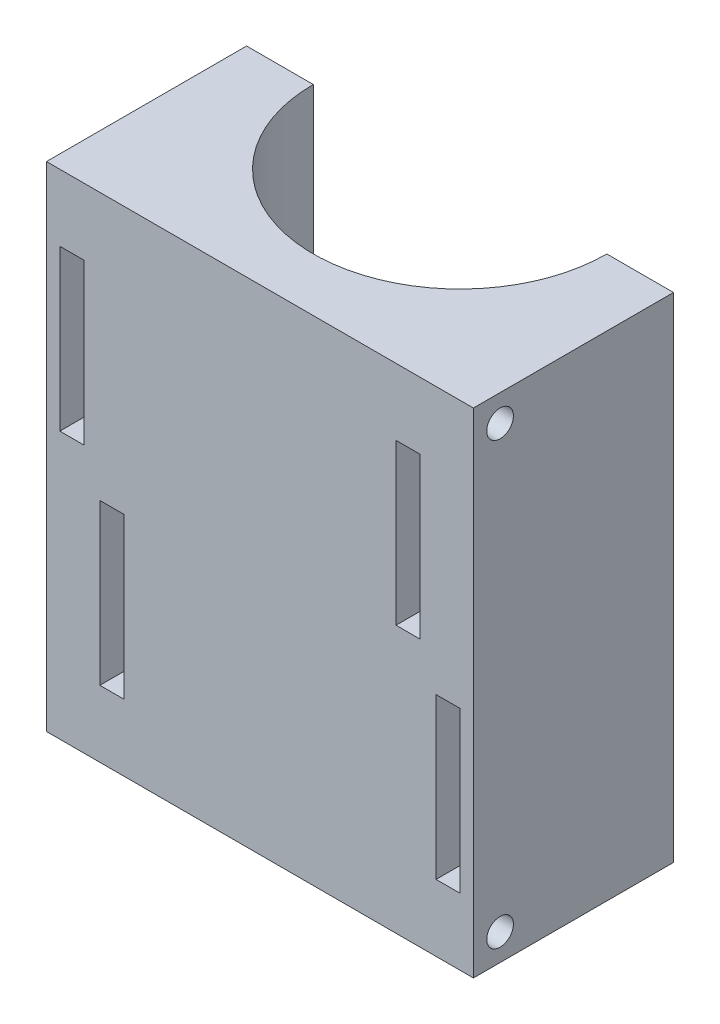
ISO-10303-21;
HEADER;
FILE_DESCRIPTION(('STEP AP214'),'2;1');
FILE_NAME('part.step','',(''),(''),'','','');
FILE_SCHEMA(('AUTOMOTIVE_DESIGN { 1 0 10303 214 1 1 1 1 }'));
ENDSEC;
DATA;
#1=APPLICATION_CONTEXT('core data for automotive mechanical design processes');
#2=APPLICATION_PROTOCOL_DEFINITION('international standard','automotive_design',2000,#1);
#3=PRODUCT_CONTEXT('',#1,'mechanical');
#4=PRODUCT('Part','Part','',(#3));
#5=PRODUCT_RELATED_PRODUCT_CATEGORY('part','',(#4));
#6=PRODUCT_DEFINITION_FORMATION('','',#4);
#7=PRODUCT_DEFINITION_CONTEXT('part definition',#1,'design');
#8=PRODUCT_DEFINITION('design','',#6,#7);
#9=PRODUCT_DEFINITION_SHAPE('','',#8);
#10=(LENGTH_UNIT() NAMED_UNIT(*) SI_UNIT(.MILLI.,.METRE.));
#11=(NAMED_UNIT(*) PLANE_ANGLE_UNIT() SI_UNIT($,.RADIAN.));
#12=(NAMED_UNIT(*) SI_UNIT($,.STERADIAN.) SOLID_ANGLE_UNIT());
#13=UNCERTAINTY_MEASURE_WITH_UNIT(LENGTH_MEASURE(1.E-05),#10,'distance_accuracy_value','');
#14=(GEOMETRIC_REPRESENTATION_CONTEXT(3) GLOBAL_UNCERTAINTY_ASSIGNED_CONTEXT((#13)) GLOBAL_UNIT_ASSIGNED_CONTEXT((#10,
#11,#12)) REPRESENTATION_CONTEXT('',''));
#15=CARTESIAN_POINT('',(0.,0.,0.));
#16=DIRECTION('',(0.,0.,1.));
#17=DIRECTION('',(1.,0.,0.));
#18=AXIS2_PLACEMENT_3D('',#15,#16,#17);
#19=CARTESIAN_POINT('',(-16.,30.,-53.5));
#20=DIRECTION('',(1.,0.,0.));
#21=DIRECTION('',(0.,0.,-1.));
#22=AXIS2_PLACEMENT_3D('',#19,#20,#21);
#23=PLANE('',#22);
#24=CARTESIAN_POINT('',(-16.,-1.50000000000001,13.));
#25=DIRECTION('',(1.,0.,0.));
#26=DIRECTION('',(0.,0.,-1.));
#27=AXIS2_PLACEMENT_3D('',#24,#25,#26);
#28=CIRCLE('',#27,1.);
#29=CARTESIAN_POINT('',(-16.,-1.50000000000001,12.));
#30=VERTEX_POINT('',#29);
#31=EDGE_CURVE('E350',#30,#30,#28,.T.);
#32=ORIENTED_EDGE('',*,*,#31,.T.);
#33=EDGE_LOOP('',(#32));
#34=FACE_BOUND('',#33,.T.);
#35=CARTESIAN_POINT('',(-16.,31.5,13.));
#36=DIRECTION('',(1.,0.,0.));
#37=DIRECTION('',(0.,0.,-1.));
#38=AXIS2_PLACEMENT_3D('',#35,#36,#37);
#39=CIRCLE('',#38,1.);
#40=CARTESIAN_POINT('',(-16.,31.5,12.));
#41=VERTEX_POINT('',#40);
#42=EDGE_CURVE('E346',#41,#41,#39,.T.);
#43=ORIENTED_EDGE('',*,*,#42,.T.);
#44=EDGE_LOOP('',(#43));
#45=FACE_BOUND('',#44,.T.);
#46=DIRECTION('',(0.,0.,1.));
#47=VECTOR('',#46,1.);
#48=CARTESIAN_POINT('',(-16.,33.5,-53.5));
#49=LINE('',#48,#47);
#50=CARTESIAN_POINT('',(-16.,33.5,0.));
#51=VERTEX_POINT('',#50);
#52=CARTESIAN_POINT('',(-16.,33.5,15.));
#53=VERTEX_POINT('',#52);
#54=EDGE_CURVE('E219',#51,#53,#49,.T.);
#55=ORIENTED_EDGE('',*,*,#54,.F.);
#56=DIRECTION('',(0.,-1.,0.));
#57=VECTOR('',#56,1.);
#58=CARTESIAN_POINT('',(-16.,33.5,0.));
#59=LINE('',#58,#57);
#60=CARTESIAN_POINT('',(-16.,-3.50000000000001,0.));
#61=VERTEX_POINT('',#60);
#62=EDGE_CURVE('E212',#51,#61,#59,.T.);
#63=ORIENTED_EDGE('',*,*,#62,.T.);
#64=DIRECTION('',(0.,0.,-1.));
#65=VECTOR('',#64,1.);
#66=CARTESIAN_POINT('',(-16.,-3.50000000000001,-26.5));
#67=LINE('',#66,#65);
#68=CARTESIAN_POINT('',(-16.,-3.5,15.));
#69=VERTEX_POINT('',#68);
#70=EDGE_CURVE('E223',#69,#61,#67,.T.);
#71=ORIENTED_EDGE('',*,*,#70,.F.);
#72=DIRECTION('',(0.,-1.,0.));
#73=VECTOR('',#72,1.);
#74=CARTESIAN_POINT('',(-16.,33.5,15.));
#75=LINE('',#74,#73);
#76=EDGE_CURVE('E294',#53,#69,#75,.T.);
#77=ORIENTED_EDGE('',*,*,#76,.F.);
#78=EDGE_LOOP('',(#55,#63,#71,#77));
#79=FACE_BOUND('',#78,.T.);
#80=ADVANCED_FACE('F35',(#34,#45,#79),#23,.F.);
#81=CARTESIAN_POINT('',(16.,30.,-53.5));
#82=DIRECTION('',(-1.,0.,0.));
#83=DIRECTION('',(0.,0.,1.));
#84=AXIS2_PLACEMENT_3D('',#81,#82,#83);
#85=PLANE('',#84);
#86=CARTESIAN_POINT('',(16.,-1.50000000000001,13.));
#87=DIRECTION('',(1.,0.,0.));
#88=DIRECTION('',(0.,0.,-1.));
#89=AXIS2_PLACEMENT_3D('',#86,#87,#88);
#90=CIRCLE('',#89,1.);
#91=CARTESIAN_POINT('',(16.,-1.50000000000001,12.));
#92=VERTEX_POINT('',#91);
#93=EDGE_CURVE('E353',#92,#92,#90,.T.);
#94=ORIENTED_EDGE('',*,*,#93,.F.);
#95=EDGE_LOOP('',(#94));
#96=FACE_BOUND('',#95,.T.);
#97=CARTESIAN_POINT('',(16.,31.5,13.));
#98=DIRECTION('',(1.,0.,0.));
#99=DIRECTION('',(0.,0.,-1.));
#100=AXIS2_PLACEMENT_3D('',#97,#98,#99);
#101=CIRCLE('',#100,1.);
#102=CARTESIAN_POINT('',(16.,31.5,12.));
#103=VERTEX_POINT('',#102);
#104=EDGE_CURVE('E347',#103,#103,#101,.T.);
#105=ORIENTED_EDGE('',*,*,#104,.F.);
#106=EDGE_LOOP('',(#105));
#107=FACE_BOUND('',#106,.T.);
#108=DIRECTION('',(0.,0.,1.));
#109=VECTOR('',#108,1.);
#110=CARTESIAN_POINT('',(16.,-3.50000000000001,-53.5));
#111=LINE('',#110,#109);
#112=CARTESIAN_POINT('',(16.,-3.50000000000001,0.));
#113=VERTEX_POINT('',#112);
#114=CARTESIAN_POINT('',(16.,-3.5,15.));
#115=VERTEX_POINT('',#114);
#116=EDGE_CURVE('E211',#113,#115,#111,.T.);
#117=ORIENTED_EDGE('',*,*,#116,.F.);
#118=DIRECTION('',(0.,-1.,0.));
#119=VECTOR('',#118,1.);
#120=CARTESIAN_POINT('',(16.,33.5,0.));
#121=LINE('',#120,#119);
#122=CARTESIAN_POINT('',(16.,33.5,0.));
#123=VERTEX_POINT('',#122);
#124=EDGE_CURVE('E196',#123,#113,#121,.T.);
#125=ORIENTED_EDGE('',*,*,#124,.F.);
#126=DIRECTION('',(0.,0.,-1.));
#127=VECTOR('',#126,1.);
#128=CARTESIAN_POINT('',(16.,33.5,-26.5));
#129=LINE('',#128,#127);
#130=CARTESIAN_POINT('',(16.,33.5,15.));
#131=VERTEX_POINT('',#130);
#132=EDGE_CURVE('E42',#131,#123,#129,.T.);
#133=ORIENTED_EDGE('',*,*,#132,.F.);
#134=DIRECTION('',(0.,1.,0.));
#135=VECTOR('',#134,1.);
#136=CARTESIAN_POINT('',(16.,-3.5,15.));
#137=LINE('',#136,#135);
#138=EDGE_CURVE('E289',#115,#131,#137,.T.);
#139=ORIENTED_EDGE('',*,*,#138,.F.);
#140=EDGE_LOOP('',(#117,#125,#133,#139));
#141=FACE_BOUND('',#140,.T.);
#142=ADVANCED_FACE('F208',(#96,#107,#141),#85,.F.);
#143=CARTESIAN_POINT('',(24.9601132838557,16.5,-24.7141258886984));
#144=DIRECTION('',(0.,1.,0.));
#145=DIRECTION('',(0.,0.,1.));
#146=AXIS2_PLACEMENT_3D('',#143,#144,#145);
#147=PLANE('',#146);
#148=DIRECTION('',(1.,0.,0.));
#149=VECTOR('',#148,1.);
#150=CARTESIAN_POINT('',(24.9601132838557,16.5,0.));
#151=LINE('',#150,#149);
#152=CARTESIAN_POINT('',(-15.,16.5,0.));
#153=VERTEX_POINT('',#152);
#154=CARTESIAN_POINT('',(-13.2,16.5,0.));
#155=VERTEX_POINT('',#154);
#156=EDGE_CURVE('E49',#153,#155,#151,.T.);
#157=ORIENTED_EDGE('',*,*,#156,.F.);
#158=DIRECTION('',(0.,0.,1.));
#159=VECTOR('',#158,1.);
#160=CARTESIAN_POINT('',(-15.,16.5,-13.5));
#161=LINE('',#160,#159);
#162=CARTESIAN_POINT('',(-15.,16.5,15.));
#163=VERTEX_POINT('',#162);
#164=EDGE_CURVE('E269',#153,#163,#161,.T.);
#165=ORIENTED_EDGE('',*,*,#164,.T.);
#166=DIRECTION('',(1.,0.,0.));
#167=VECTOR('',#166,1.);
#168=CARTESIAN_POINT('',(-15.,16.5,15.));
#169=LINE('',#168,#167);
#170=CARTESIAN_POINT('',(-13.2,16.5,15.));
#171=VERTEX_POINT('',#170);
#172=EDGE_CURVE('E298',#163,#171,#169,.T.);
#173=ORIENTED_EDGE('',*,*,#172,.T.);
#174=DIRECTION('',(0.,0.,1.));
#175=VECTOR('',#174,1.);
#176=CARTESIAN_POINT('',(-13.2,16.5,-13.5));
#177=LINE('',#176,#175);
#178=EDGE_CURVE('E271',#155,#171,#177,.T.);
#179=ORIENTED_EDGE('',*,*,#178,.F.);
#180=EDGE_LOOP('',(#157,#165,#173,#179));
#181=FACE_BOUND('',#180,.T.);
#182=ADVANCED_FACE('F465',(#181),#147,.T.);
#183=CARTESIAN_POINT('',(24.9601132838557,28.5,-24.7141258886984));
#184=DIRECTION('',(0.,1.,0.));
#185=DIRECTION('',(0.,0.,1.));
#186=AXIS2_PLACEMENT_3D('',#183,#184,#185);
#187=PLANE('',#186);
#188=DIRECTION('',(0.,0.,1.));
#189=VECTOR('',#188,1.);
#190=CARTESIAN_POINT('',(-15.,28.5,-13.5));
#191=LINE('',#190,#189);
#192=CARTESIAN_POINT('',(-15.,28.5,0.));
#193=VERTEX_POINT('',#192);
#194=CARTESIAN_POINT('',(-15.,28.5,15.));
#195=VERTEX_POINT('',#194);
#196=EDGE_CURVE('E268',#193,#195,#191,.T.);
#197=ORIENTED_EDGE('',*,*,#196,.F.);
#198=DIRECTION('',(1.,0.,0.));
#199=VECTOR('',#198,1.);
#200=CARTESIAN_POINT('',(24.9601132838557,28.5,0.));
#201=LINE('',#200,#199);
#202=CARTESIAN_POINT('',(-13.2,28.5,0.));
#203=VERTEX_POINT('',#202);
#204=EDGE_CURVE('E367',#193,#203,#201,.T.);
#205=ORIENTED_EDGE('',*,*,#204,.T.);
#206=DIRECTION('',(0.,0.,1.));
#207=VECTOR('',#206,1.);
#208=CARTESIAN_POINT('',(-13.2,28.5,-13.5));
#209=LINE('',#208,#207);
#210=CARTESIAN_POINT('',(-13.2,28.5,15.));
#211=VERTEX_POINT('',#210);
#212=EDGE_CURVE('E274',#203,#211,#209,.T.);
#213=ORIENTED_EDGE('',*,*,#212,.T.);
#214=DIRECTION('',(-1.,0.,0.));
#215=VECTOR('',#214,1.);
#216=CARTESIAN_POINT('',(-13.2,28.5,15.));
#217=LINE('',#216,#215);
#218=EDGE_CURVE('E304',#211,#195,#217,.T.);
#219=ORIENTED_EDGE('',*,*,#218,.T.);
#220=EDGE_LOOP('',(#197,#205,#213,#219));
#221=FACE_BOUND('',#220,.T.);
#222=ADVANCED_FACE('F661',(#221),#187,.F.);
#223=CARTESIAN_POINT('',(-24.9601132838557,13.5,-24.7141258886984));
#224=DIRECTION('',(0.,-1.,0.));
#225=DIRECTION('',(0.,0.,1.));
#226=AXIS2_PLACEMENT_3D('',#223,#224,#225);
#227=PLANE('',#226);
#228=DIRECTION('',(-1.,0.,0.));
#229=VECTOR('',#228,1.);
#230=CARTESIAN_POINT('',(-24.9601132838557,13.5,0.));
#231=LINE('',#230,#229);
#232=CARTESIAN_POINT('',(15.,13.5,0.));
#233=VERTEX_POINT('',#232);
#234=CARTESIAN_POINT('',(13.2,13.5,0.));
#235=VERTEX_POINT('',#234);
#236=EDGE_CURVE('E375',#233,#235,#231,.T.);
#237=ORIENTED_EDGE('',*,*,#236,.F.);
#238=DIRECTION('',(0.,0.,1.));
#239=VECTOR('',#238,1.);
#240=CARTESIAN_POINT('',(15.,13.5,-13.5));
#241=LINE('',#240,#239);
#242=CARTESIAN_POINT('',(15.,13.5,15.));
#243=VERTEX_POINT('',#242);
#244=EDGE_CURVE('E282',#233,#243,#241,.T.);
#245=ORIENTED_EDGE('',*,*,#244,.T.);
#246=DIRECTION('',(-1.,0.,0.));
#247=VECTOR('',#246,1.);
#248=CARTESIAN_POINT('',(15.,13.5,15.));
#249=LINE('',#248,#247);
#250=CARTESIAN_POINT('',(13.2,13.5,15.));
#251=VERTEX_POINT('',#250);
#252=EDGE_CURVE('E322',#243,#251,#249,.T.);
#253=ORIENTED_EDGE('',*,*,#252,.T.);
#254=DIRECTION('',(0.,0.,1.));
#255=VECTOR('',#254,1.);
#256=CARTESIAN_POINT('',(13.2,13.5,-13.5));
#257=LINE('',#256,#255);
#258=EDGE_CURVE('E272',#235,#251,#257,.T.);
#259=ORIENTED_EDGE('',*,*,#258,.F.);
#260=EDGE_LOOP('',(#237,#245,#253,#259));
#261=FACE_BOUND('',#260,.T.);
#262=ADVANCED_FACE('F649',(#261),#227,.T.);
#263=CARTESIAN_POINT('',(-24.9601132838557,1.5,-24.7141258886984));
#264=DIRECTION('',(0.,-1.,0.));
#265=DIRECTION('',(0.,0.,1.));
#266=AXIS2_PLACEMENT_3D('',#263,#264,#265);
#267=PLANE('',#266);
#268=DIRECTION('',(0.,0.,1.));
#269=VECTOR('',#268,1.);
#270=CARTESIAN_POINT('',(15.,1.5,-13.5));
#271=LINE('',#270,#269);
#272=CARTESIAN_POINT('',(15.,1.5,0.));
#273=VERTEX_POINT('',#272);
#274=CARTESIAN_POINT('',(15.,1.5,15.));
#275=VERTEX_POINT('',#274);
#276=EDGE_CURVE('E279',#273,#275,#271,.T.);
#277=ORIENTED_EDGE('',*,*,#276,.F.);
#278=DIRECTION('',(-1.,0.,0.));
#279=VECTOR('',#278,1.);
#280=CARTESIAN_POINT('',(-24.9601132838557,1.5,0.));
#281=LINE('',#280,#279);
#282=CARTESIAN_POINT('',(13.2,1.5,0.));
#283=VERTEX_POINT('',#282);
#284=EDGE_CURVE('E57',#273,#283,#281,.T.);
#285=ORIENTED_EDGE('',*,*,#284,.T.);
#286=DIRECTION('',(0.,0.,1.));
#287=VECTOR('',#286,1.);
#288=CARTESIAN_POINT('',(13.2,1.5,-13.5));
#289=LINE('',#288,#287);
#290=CARTESIAN_POINT('',(13.2,1.5,15.));
#291=VERTEX_POINT('',#290);
#292=EDGE_CURVE('E277',#283,#291,#289,.T.);
#293=ORIENTED_EDGE('',*,*,#292,.T.);
#294=DIRECTION('',(1.,0.,0.));
#295=VECTOR('',#294,1.);
#296=CARTESIAN_POINT('',(13.2,1.5,15.));
#297=LINE('',#296,#295);
#298=EDGE_CURVE('E328',#291,#275,#297,.T.);
#299=ORIENTED_EDGE('',*,*,#298,.T.);
#300=EDGE_LOOP('',(#277,#285,#293,#299));
#301=FACE_BOUND('',#300,.T.);
#302=ADVANCED_FACE('F635',(#301),#267,.F.);
#303=CARTESIAN_POINT('',(0.,33.5,-40.));
#304=DIRECTION('',(0.,1.,0.));
#305=DIRECTION('',(0.,0.,1.));
#306=AXIS2_PLACEMENT_3D('',#303,#304,#305);
#307=PLANE('',#306);
#308=DIRECTION('',(-1.,0.,0.));
#309=VECTOR('',#308,1.);
#310=CARTESIAN_POINT('',(16.,33.5,0.));
#311=LINE('',#310,#309);
#312=CARTESIAN_POINT('',(-11.,33.5,0.));
#313=VERTEX_POINT('',#312);
#314=EDGE_CURVE('E204',#313,#51,#311,.T.);
#315=ORIENTED_EDGE('',*,*,#314,.T.);
#316=ORIENTED_EDGE('',*,*,#54,.T.);
#317=DIRECTION('',(-1.,0.,0.));
#318=VECTOR('',#317,1.);
#319=CARTESIAN_POINT('',(16.,33.5,15.));
#320=LINE('',#319,#318);
#321=EDGE_CURVE('E218',#131,#53,#320,.T.);
#322=ORIENTED_EDGE('',*,*,#321,.F.);
#323=ORIENTED_EDGE('',*,*,#132,.T.);
#324=CARTESIAN_POINT('',(11.,33.5,0.));
#325=VERTEX_POINT('',#324);
#326=EDGE_CURVE('E193',#123,#325,#311,.T.);
#327=ORIENTED_EDGE('',*,*,#326,.T.);
#328=CARTESIAN_POINT('',(0.,33.5,0.));
#329=DIRECTION('',(0.,1.,0.));
#330=DIRECTION('',(0.,0.,1.));
#331=AXIS2_PLACEMENT_3D('',#328,#329,#330);
#332=CIRCLE('',#331,11.);
#333=EDGE_CURVE('E280',#313,#325,#332,.T.);
#334=ORIENTED_EDGE('',*,*,#333,.F.);
#335=EDGE_LOOP('',(#315,#316,#322,#323,#327,#334));
#336=FACE_BOUND('',#335,.T.);
#337=ADVANCED_FACE('F216',(#336),#307,.T.);
#338=CARTESIAN_POINT('',(0.,-3.50000000000001,-40.));
#339=DIRECTION('',(0.,-1.,0.));
#340=DIRECTION('',(0.,0.,-1.));
#341=AXIS2_PLACEMENT_3D('',#338,#339,#340);
#342=PLANE('',#341);
#343=DIRECTION('',(-1.,0.,0.));
#344=VECTOR('',#343,1.);
#345=CARTESIAN_POINT('',(16.,-3.50000000000001,0.));
#346=LINE('',#345,#344);
#347=CARTESIAN_POINT('',(11.,-3.5,0.));
#348=VERTEX_POINT('',#347);
#349=EDGE_CURVE('E380',#113,#348,#346,.T.);
#350=ORIENTED_EDGE('',*,*,#349,.F.);
#351=ORIENTED_EDGE('',*,*,#116,.T.);
#352=DIRECTION('',(1.,0.,0.));
#353=VECTOR('',#352,1.);
#354=CARTESIAN_POINT('',(-16.,-3.5,15.));
#355=LINE('',#354,#353);
#356=EDGE_CURVE('E291',#69,#115,#355,.T.);
#357=ORIENTED_EDGE('',*,*,#356,.F.);
#358=ORIENTED_EDGE('',*,*,#70,.T.);
#359=CARTESIAN_POINT('',(-11.,-3.5,0.));
#360=VERTEX_POINT('',#359);
#361=EDGE_CURVE('E381',#360,#61,#346,.T.);
#362=ORIENTED_EDGE('',*,*,#361,.F.);
#363=CARTESIAN_POINT('',(0.,-3.5,0.));
#364=DIRECTION('',(0.,-1.,0.));
#365=DIRECTION('',(0.,0.,-1.));
#366=AXIS2_PLACEMENT_3D('',#363,#364,#365);
#367=CIRCLE('',#366,11.);
#368=EDGE_CURVE('E286',#348,#360,#367,.T.);
#369=ORIENTED_EDGE('',*,*,#368,.F.);
#370=EDGE_LOOP('',(#350,#351,#357,#358,#362,#369));
#371=FACE_BOUND('',#370,.T.);
#372=ADVANCED_FACE('F393',(#371),#342,.T.);
#373=CARTESIAN_POINT('',(0.,30.,0.));
#374=DIRECTION('',(0.,-1.,0.));
#375=DIRECTION('',(0.,0.,-1.));
#376=AXIS2_PLACEMENT_3D('',#373,#374,#375);
#377=CYLINDRICAL_SURFACE('',#376,11.);
#378=DIRECTION('',(0.,-1.,0.));
#379=VECTOR('',#378,1.);
#380=CARTESIAN_POINT('',(-11.,30.,0.));
#381=LINE('',#380,#379);
#382=CARTESIAN_POINT('',(-11.,13.5,0.));
#383=VERTEX_POINT('',#382);
#384=EDGE_CURVE('E356',#313,#383,#381,.T.);
#385=ORIENTED_EDGE('',*,*,#384,.F.);
#386=ORIENTED_EDGE('',*,*,#333,.T.);
#387=DIRECTION('',(0.,-1.,0.));
#388=VECTOR('',#387,1.);
#389=CARTESIAN_POINT('',(11.,30.,0.));
#390=LINE('',#389,#388);
#391=CARTESIAN_POINT('',(11.,28.5,0.));
#392=VERTEX_POINT('',#391);
#393=EDGE_CURVE('E199',#392,#325,#390,.F.);
#394=ORIENTED_EDGE('',*,*,#393,.F.);
#395=CARTESIAN_POINT('',(0.,28.5,0.));
#396=DIRECTION('',(0.,1.,0.));
#397=DIRECTION('',(-1.,0.,0.));
#398=AXIS2_PLACEMENT_3D('',#395,#396,#397);
#399=CIRCLE('',#398,11.);
#400=CARTESIAN_POINT('',(10.2,28.5,4.1182520563948));
#401=VERTEX_POINT('',#400);
#402=EDGE_CURVE('E228',#401,#392,#399,.T.);
#403=ORIENTED_EDGE('',*,*,#402,.F.);
#404=DIRECTION('',(0.,-1.,0.));
#405=VECTOR('',#404,1.);
#406=CARTESIAN_POINT('',(10.2,30.,4.1182520563948));
#407=LINE('',#406,#405);
#408=CARTESIAN_POINT('',(10.2,16.5,4.11825205639479));
#409=VERTEX_POINT('',#408);
#410=EDGE_CURVE('E226',#409,#401,#407,.F.);
#411=ORIENTED_EDGE('',*,*,#410,.F.);
#412=CARTESIAN_POINT('',(0.,16.5,0.));
#413=DIRECTION('',(0.,-1.,0.));
#414=DIRECTION('',(0.,0.,-1.));
#415=AXIS2_PLACEMENT_3D('',#412,#413,#414);
#416=CIRCLE('',#415,11.);
#417=CARTESIAN_POINT('',(11.,16.5,0.));
#418=VERTEX_POINT('',#417);
#419=EDGE_CURVE('E231',#418,#409,#416,.T.);
#420=ORIENTED_EDGE('',*,*,#419,.F.);
#421=EDGE_CURVE('E361',#348,#418,#390,.F.);
#422=ORIENTED_EDGE('',*,*,#421,.F.);
#423=ORIENTED_EDGE('',*,*,#368,.T.);
#424=CARTESIAN_POINT('',(-11.,1.5,0.));
#425=VERTEX_POINT('',#424);
#426=EDGE_CURVE('E359',#425,#360,#381,.T.);
#427=ORIENTED_EDGE('',*,*,#426,.F.);
#428=CARTESIAN_POINT('',(0.,1.50000000000003,0.));
#429=DIRECTION('',(0.,-1.,0.));
#430=DIRECTION('',(1.,0.,0.));
#431=AXIS2_PLACEMENT_3D('',#428,#429,#430);
#432=CIRCLE('',#431,11.);
#433=CARTESIAN_POINT('',(-10.2,1.5,4.1182520563948));
#434=VERTEX_POINT('',#433);
#435=EDGE_CURVE('E237',#434,#425,#432,.T.);
#436=ORIENTED_EDGE('',*,*,#435,.F.);
#437=DIRECTION('',(0.,-1.,0.));
#438=VECTOR('',#437,1.);
#439=CARTESIAN_POINT('',(-10.2,30.,4.1182520563948));
#440=LINE('',#439,#438);
#441=CARTESIAN_POINT('',(-10.2,13.5,4.1182520563948));
#442=VERTEX_POINT('',#441);
#443=EDGE_CURVE('E235',#442,#434,#440,.T.);
#444=ORIENTED_EDGE('',*,*,#443,.F.);
#445=CARTESIAN_POINT('',(0.,13.5,0.));
#446=DIRECTION('',(0.,1.,0.));
#447=DIRECTION('',(0.,0.,1.));
#448=AXIS2_PLACEMENT_3D('',#445,#446,#447);
#449=CIRCLE('',#448,11.);
#450=EDGE_CURVE('E233',#383,#442,#449,.T.);
#451=ORIENTED_EDGE('',*,*,#450,.F.);
#452=EDGE_LOOP('',(#385,#386,#394,#403,#411,#420,#422,#423,#427,#436,#444,#451));
#453=FACE_BOUND('',#452,.T.);
#454=ADVANCED_FACE('F430',(#453),#377,.F.);
#455=CARTESIAN_POINT('',(-12.,1.5,0.));
#456=DIRECTION('',(-1.,0.,0.));
#457=DIRECTION('',(0.,0.,1.));
#458=AXIS2_PLACEMENT_3D('',#455,#456,#457);
#459=PLANE('',#458);
#460=DIRECTION('',(0.,0.,1.));
#461=VECTOR('',#460,1.);
#462=CARTESIAN_POINT('',(-12.,13.5,0.));
#463=LINE('',#462,#461);
#464=CARTESIAN_POINT('',(-12.,13.5,0.));
#465=VERTEX_POINT('',#464);
#466=CARTESIAN_POINT('',(-12.,13.5,15.));
#467=VERTEX_POINT('',#466);
#468=EDGE_CURVE('E240',#465,#467,#463,.T.);
#469=ORIENTED_EDGE('',*,*,#468,.T.);
#470=DIRECTION('',(0.,-1.,0.));
#471=VECTOR('',#470,1.);
#472=CARTESIAN_POINT('',(-12.,13.5,15.));
#473=LINE('',#472,#471);
#474=CARTESIAN_POINT('',(-12.,1.49999999999999,15.));
#475=VERTEX_POINT('',#474);
#476=EDGE_CURVE('E313',#467,#475,#473,.T.);
#477=ORIENTED_EDGE('',*,*,#476,.T.);
#478=DIRECTION('',(0.,0.,1.));
#479=VECTOR('',#478,1.);
#480=CARTESIAN_POINT('',(-12.,1.5,0.));
#481=LINE('',#480,#479);
#482=CARTESIAN_POINT('',(-12.,1.5,0.));
#483=VERTEX_POINT('',#482);
#484=EDGE_CURVE('E241',#483,#475,#481,.T.);
#485=ORIENTED_EDGE('',*,*,#484,.F.);
#486=DIRECTION('',(0.,-1.,0.));
#487=VECTOR('',#486,1.);
#488=CARTESIAN_POINT('',(-12.,1.5,0.));
#489=LINE('',#488,#487);
#490=EDGE_CURVE('E252',#465,#483,#489,.T.);
#491=ORIENTED_EDGE('',*,*,#490,.F.);
#492=EDGE_LOOP('',(#469,#477,#485,#491));
#493=FACE_BOUND('',#492,.T.);
#494=ADVANCED_FACE('F449',(#493),#459,.F.);
#495=CARTESIAN_POINT('',(-12.,13.5,0.));
#496=DIRECTION('',(0.,1.,0.));
#497=DIRECTION('',(0.,0.,1.));
#498=AXIS2_PLACEMENT_3D('',#495,#496,#497);
#499=PLANE('',#498);
#500=ORIENTED_EDGE('',*,*,#450,.T.);
#501=DIRECTION('',(0.,0.,1.));
#502=VECTOR('',#501,1.);
#503=CARTESIAN_POINT('',(-10.2,13.5,0.));
#504=LINE('',#503,#502);
#505=CARTESIAN_POINT('',(-10.2,13.5,15.));
#506=VERTEX_POINT('',#505);
#507=EDGE_CURVE('E246',#442,#506,#504,.T.);
#508=ORIENTED_EDGE('',*,*,#507,.T.);
#509=DIRECTION('',(-1.,0.,0.));
#510=VECTOR('',#509,1.);
#511=CARTESIAN_POINT('',(-10.2,13.5,15.));
#512=LINE('',#511,#510);
#513=EDGE_CURVE('E316',#506,#467,#512,.T.);
#514=ORIENTED_EDGE('',*,*,#513,.T.);
#515=ORIENTED_EDGE('',*,*,#468,.F.);
#516=DIRECTION('',(-1.,0.,0.));
#517=VECTOR('',#516,1.);
#518=CARTESIAN_POINT('',(-12.,13.5,0.));
#519=LINE('',#518,#517);
#520=EDGE_CURVE('E244',#383,#465,#519,.T.);
#521=ORIENTED_EDGE('',*,*,#520,.F.);
#522=EDGE_LOOP('',(#500,#508,#514,#515,#521));
#523=FACE_BOUND('',#522,.T.);
#524=ADVANCED_FACE('F435',(#523),#499,.F.);
#525=CARTESIAN_POINT('',(-10.2,1.5,0.));
#526=DIRECTION('',(1.,0.,0.));
#527=DIRECTION('',(0.,0.,-1.));
#528=AXIS2_PLACEMENT_3D('',#525,#526,#527);
#529=PLANE('',#528);
#530=ORIENTED_EDGE('',*,*,#443,.T.);
#531=DIRECTION('',(0.,0.,1.));
#532=VECTOR('',#531,1.);
#533=CARTESIAN_POINT('',(-10.2,1.5,0.));
#534=LINE('',#533,#532);
#535=CARTESIAN_POINT('',(-10.2,1.5,15.));
#536=VERTEX_POINT('',#535);
#537=EDGE_CURVE('E243',#434,#536,#534,.T.);
#538=ORIENTED_EDGE('',*,*,#537,.T.);
#539=DIRECTION('',(0.,1.,0.));
#540=VECTOR('',#539,1.);
#541=CARTESIAN_POINT('',(-10.2,1.5,15.));
#542=LINE('',#541,#540);
#543=EDGE_CURVE('E319',#536,#506,#542,.T.);
#544=ORIENTED_EDGE('',*,*,#543,.T.);
#545=ORIENTED_EDGE('',*,*,#507,.F.);
#546=EDGE_LOOP('',(#530,#538,#544,#545));
#547=FACE_BOUND('',#546,.T.);
#548=ADVANCED_FACE('F442',(#547),#529,.F.);
#549=CARTESIAN_POINT('',(-12.,1.5,0.));
#550=DIRECTION('',(0.,-1.,0.));
#551=DIRECTION('',(1.,0.,0.));
#552=AXIS2_PLACEMENT_3D('',#549,#550,#551);
#553=PLANE('',#552);
#554=ORIENTED_EDGE('',*,*,#435,.T.);
#555=DIRECTION('',(1.,0.,0.));
#556=VECTOR('',#555,1.);
#557=CARTESIAN_POINT('',(-12.,1.5,0.));
#558=LINE('',#557,#556);
#559=EDGE_CURVE('E250',#483,#425,#558,.T.);
#560=ORIENTED_EDGE('',*,*,#559,.F.);
#561=ORIENTED_EDGE('',*,*,#484,.T.);
#562=DIRECTION('',(1.,0.,0.));
#563=VECTOR('',#562,1.);
#564=CARTESIAN_POINT('',(-12.,1.49999999999999,15.));
#565=LINE('',#564,#563);
#566=EDGE_CURVE('E310',#475,#536,#565,.T.);
#567=ORIENTED_EDGE('',*,*,#566,.T.);
#568=ORIENTED_EDGE('',*,*,#537,.F.);
#569=EDGE_LOOP('',(#554,#560,#561,#567,#568));
#570=FACE_BOUND('',#569,.T.);
#571=ADVANCED_FACE('F444',(#570),#553,.F.);
#572=CARTESIAN_POINT('',(10.2,28.5,0.));
#573=DIRECTION('',(-1.,0.,0.));
#574=DIRECTION('',(0.,-1.,0.));
#575=AXIS2_PLACEMENT_3D('',#572,#573,#574);
#576=PLANE('',#575);
#577=ORIENTED_EDGE('',*,*,#410,.T.);
#578=DIRECTION('',(0.,0.,1.));
#579=VECTOR('',#578,1.);
#580=CARTESIAN_POINT('',(10.2,28.5,0.));
#581=LINE('',#580,#579);
#582=CARTESIAN_POINT('',(10.2,28.5,15.));
#583=VERTEX_POINT('',#582);
#584=EDGE_CURVE('E254',#401,#583,#581,.T.);
#585=ORIENTED_EDGE('',*,*,#584,.T.);
#586=DIRECTION('',(0.,-1.,0.));
#587=VECTOR('',#586,1.);
#588=CARTESIAN_POINT('',(10.2,28.5,15.));
#589=LINE('',#588,#587);
#590=CARTESIAN_POINT('',(10.2,16.5,15.));
#591=VERTEX_POINT('',#590);
#592=EDGE_CURVE('E343',#583,#591,#589,.T.);
#593=ORIENTED_EDGE('',*,*,#592,.T.);
#594=DIRECTION('',(0.,0.,1.));
#595=VECTOR('',#594,1.);
#596=CARTESIAN_POINT('',(10.2,16.5,0.));
#597=LINE('',#596,#595);
#598=EDGE_CURVE('E255',#409,#591,#597,.T.);
#599=ORIENTED_EDGE('',*,*,#598,.F.);
#600=EDGE_LOOP('',(#577,#585,#593,#599));
#601=FACE_BOUND('',#600,.T.);
#602=ADVANCED_FACE('F419',(#601),#576,.F.);
#603=CARTESIAN_POINT('',(10.2,28.5,0.));
#604=DIRECTION('',(0.,1.,0.));
#605=DIRECTION('',(-1.,0.,0.));
#606=AXIS2_PLACEMENT_3D('',#603,#604,#605);
#607=PLANE('',#606);
#608=ORIENTED_EDGE('',*,*,#402,.T.);
#609=DIRECTION('',(-1.,0.,0.));
#610=VECTOR('',#609,1.);
#611=CARTESIAN_POINT('',(10.2,28.5,0.));
#612=LINE('',#611,#610);
#613=CARTESIAN_POINT('',(12.,28.5,0.));
#614=VERTEX_POINT('',#613);
#615=EDGE_CURVE('E258',#614,#392,#612,.T.);
#616=ORIENTED_EDGE('',*,*,#615,.F.);
#617=DIRECTION('',(0.,0.,1.));
#618=VECTOR('',#617,1.);
#619=CARTESIAN_POINT('',(12.,28.5,0.));
#620=LINE('',#619,#618);
#621=CARTESIAN_POINT('',(12.,28.5,15.));
#622=VERTEX_POINT('',#621);
#623=EDGE_CURVE('E260',#614,#622,#620,.T.);
#624=ORIENTED_EDGE('',*,*,#623,.T.);
#625=DIRECTION('',(-1.,0.,0.));
#626=VECTOR('',#625,1.);
#627=CARTESIAN_POINT('',(12.,28.5,15.));
#628=LINE('',#627,#626);
#629=EDGE_CURVE('E334',#622,#583,#628,.T.);
#630=ORIENTED_EDGE('',*,*,#629,.T.);
#631=ORIENTED_EDGE('',*,*,#584,.F.);
#632=EDGE_LOOP('',(#608,#616,#624,#630,#631));
#633=FACE_BOUND('',#632,.T.);
#634=ADVANCED_FACE('F423',(#633),#607,.F.);
#635=CARTESIAN_POINT('',(12.,28.5,0.));
#636=DIRECTION('',(1.,0.,0.));
#637=DIRECTION('',(0.,1.,0.));
#638=AXIS2_PLACEMENT_3D('',#635,#636,#637);
#639=PLANE('',#638);
#640=DIRECTION('',(0.,0.,1.));
#641=VECTOR('',#640,1.);
#642=CARTESIAN_POINT('',(12.,16.5,0.));
#643=LINE('',#642,#641);
#644=CARTESIAN_POINT('',(12.,16.5,0.));
#645=VERTEX_POINT('',#644);
#646=CARTESIAN_POINT('',(12.,16.5,15.));
#647=VERTEX_POINT('',#646);
#648=EDGE_CURVE('E257',#645,#647,#643,.T.);
#649=ORIENTED_EDGE('',*,*,#648,.T.);
#650=DIRECTION('',(0.,1.,0.));
#651=VECTOR('',#650,1.);
#652=CARTESIAN_POINT('',(12.,16.5,15.));
#653=LINE('',#652,#651);
#654=EDGE_CURVE('E337',#647,#622,#653,.T.);
#655=ORIENTED_EDGE('',*,*,#654,.T.);
#656=ORIENTED_EDGE('',*,*,#623,.F.);
#657=DIRECTION('',(0.,1.,0.));
#658=VECTOR('',#657,1.);
#659=CARTESIAN_POINT('',(12.,28.5,0.));
#660=LINE('',#659,#658);
#661=EDGE_CURVE('E264',#645,#614,#660,.T.);
#662=ORIENTED_EDGE('',*,*,#661,.F.);
#663=EDGE_LOOP('',(#649,#655,#656,#662));
#664=FACE_BOUND('',#663,.T.);
#665=ADVANCED_FACE('F427',(#664),#639,.F.);
#666=CARTESIAN_POINT('',(10.2,16.5,0.));
#667=DIRECTION('',(0.,-1.,0.));
#668=DIRECTION('',(0.,0.,-1.));
#669=AXIS2_PLACEMENT_3D('',#666,#667,#668);
#670=PLANE('',#669);
#671=ORIENTED_EDGE('',*,*,#419,.T.);
#672=ORIENTED_EDGE('',*,*,#598,.T.);
#673=DIRECTION('',(1.,0.,0.));
#674=VECTOR('',#673,1.);
#675=CARTESIAN_POINT('',(10.2,16.5,15.));
#676=LINE('',#675,#674);
#677=EDGE_CURVE('E340',#591,#647,#676,.T.);
#678=ORIENTED_EDGE('',*,*,#677,.T.);
#679=ORIENTED_EDGE('',*,*,#648,.F.);
#680=DIRECTION('',(1.,0.,0.));
#681=VECTOR('',#680,1.);
#682=CARTESIAN_POINT('',(10.2,16.5,0.));
#683=LINE('',#682,#681);
#684=EDGE_CURVE('E266',#418,#645,#683,.T.);
#685=ORIENTED_EDGE('',*,*,#684,.F.);
#686=EDGE_LOOP('',(#671,#672,#678,#679,#685));
#687=FACE_BOUND('',#686,.T.);
#688=ADVANCED_FACE('F412',(#687),#670,.F.);
#689=CARTESIAN_POINT('',(-15.,28.5,-13.5));
#690=DIRECTION('',(-1.,0.,0.));
#691=DIRECTION('',(0.,0.,1.));
#692=AXIS2_PLACEMENT_3D('',#689,#690,#691);
#693=PLANE('',#692);
#694=ORIENTED_EDGE('',*,*,#164,.F.);
#695=DIRECTION('',(0.,1.,0.));
#696=VECTOR('',#695,1.);
#697=CARTESIAN_POINT('',(-15.,28.5,0.));
#698=LINE('',#697,#696);
#699=EDGE_CURVE('E363',#153,#193,#698,.T.);
#700=ORIENTED_EDGE('',*,*,#699,.T.);
#701=ORIENTED_EDGE('',*,*,#196,.T.);
#702=DIRECTION('',(0.,-1.,0.));
#703=VECTOR('',#702,1.);
#704=CARTESIAN_POINT('',(-15.,28.5,15.));
#705=LINE('',#704,#703);
#706=EDGE_CURVE('E301',#195,#163,#705,.T.);
#707=ORIENTED_EDGE('',*,*,#706,.T.);
#708=EDGE_LOOP('',(#694,#700,#701,#707));
#709=FACE_BOUND('',#708,.T.);
#710=ADVANCED_FACE('F494',(#709),#693,.F.);
#711=CARTESIAN_POINT('',(-13.2,28.5,-13.5));
#712=DIRECTION('',(1.,0.,0.));
#713=DIRECTION('',(0.,1.,0.));
#714=AXIS2_PLACEMENT_3D('',#711,#712,#713);
#715=PLANE('',#714);
#716=ORIENTED_EDGE('',*,*,#212,.F.);
#717=DIRECTION('',(0.,-1.,0.));
#718=VECTOR('',#717,1.);
#719=CARTESIAN_POINT('',(-13.2,28.5,0.));
#720=LINE('',#719,#718);
#721=EDGE_CURVE('E370',#203,#155,#720,.T.);
#722=ORIENTED_EDGE('',*,*,#721,.T.);
#723=ORIENTED_EDGE('',*,*,#178,.T.);
#724=DIRECTION('',(0.,1.,0.));
#725=VECTOR('',#724,1.);
#726=CARTESIAN_POINT('',(-13.2,16.5,15.));
#727=LINE('',#726,#725);
#728=EDGE_CURVE('E307',#171,#211,#727,.T.);
#729=ORIENTED_EDGE('',*,*,#728,.T.);
#730=EDGE_LOOP('',(#716,#722,#723,#729));
#731=FACE_BOUND('',#730,.T.);
#732=ADVANCED_FACE('F490',(#731),#715,.F.);
#733=CARTESIAN_POINT('',(13.2,13.5,-13.5));
#734=DIRECTION('',(-1.,0.,0.));
#735=DIRECTION('',(0.,-1.,0.));
#736=AXIS2_PLACEMENT_3D('',#733,#734,#735);
#737=PLANE('',#736);
#738=ORIENTED_EDGE('',*,*,#292,.F.);
#739=DIRECTION('',(0.,1.,0.));
#740=VECTOR('',#739,1.);
#741=CARTESIAN_POINT('',(13.2,13.5,0.));
#742=LINE('',#741,#740);
#743=EDGE_CURVE('E372',#283,#235,#742,.T.);
#744=ORIENTED_EDGE('',*,*,#743,.T.);
#745=ORIENTED_EDGE('',*,*,#258,.T.);
#746=DIRECTION('',(0.,-1.,0.));
#747=VECTOR('',#746,1.);
#748=CARTESIAN_POINT('',(13.2,13.5,15.));
#749=LINE('',#748,#747);
#750=EDGE_CURVE('E331',#251,#291,#749,.T.);
#751=ORIENTED_EDGE('',*,*,#750,.T.);
#752=EDGE_LOOP('',(#738,#744,#745,#751));
#753=FACE_BOUND('',#752,.T.);
#754=ADVANCED_FACE('F486',(#753),#737,.F.);
#755=CARTESIAN_POINT('',(15.,13.5,-13.5));
#756=DIRECTION('',(1.,0.,0.));
#757=DIRECTION('',(0.,0.,-1.));
#758=AXIS2_PLACEMENT_3D('',#755,#756,#757);
#759=PLANE('',#758);
#760=ORIENTED_EDGE('',*,*,#244,.F.);
#761=DIRECTION('',(0.,-1.,0.));
#762=VECTOR('',#761,1.);
#763=CARTESIAN_POINT('',(15.,13.5,0.));
#764=LINE('',#763,#762);
#765=EDGE_CURVE('E11',#233,#273,#764,.T.);
#766=ORIENTED_EDGE('',*,*,#765,.T.);
#767=ORIENTED_EDGE('',*,*,#276,.T.);
#768=DIRECTION('',(0.,1.,0.));
#769=VECTOR('',#768,1.);
#770=CARTESIAN_POINT('',(15.,1.5,15.));
#771=LINE('',#770,#769);
#772=EDGE_CURVE('E325',#275,#243,#771,.T.);
#773=ORIENTED_EDGE('',*,*,#772,.T.);
#774=EDGE_LOOP('',(#760,#766,#767,#773));
#775=FACE_BOUND('',#774,.T.);
#776=ADVANCED_FACE('F399',(#775),#759,.F.);
#777=CARTESIAN_POINT('',(0.,0.,15.));
#778=DIRECTION('',(0.,0.,1.));
#779=DIRECTION('',(1.,0.,0.));
#780=AXIS2_PLACEMENT_3D('',#777,#778,#779);
#781=PLANE('',#780);
#782=ORIENTED_EDGE('',*,*,#298,.F.);
#783=ORIENTED_EDGE('',*,*,#750,.F.);
#784=ORIENTED_EDGE('',*,*,#252,.F.);
#785=ORIENTED_EDGE('',*,*,#772,.F.);
#786=EDGE_LOOP('',(#782,#783,#784,#785));
#787=FACE_BOUND('',#786,.T.);
#788=ORIENTED_EDGE('',*,*,#218,.F.);
#789=ORIENTED_EDGE('',*,*,#728,.F.);
#790=ORIENTED_EDGE('',*,*,#172,.F.);
#791=ORIENTED_EDGE('',*,*,#706,.F.);
#792=EDGE_LOOP('',(#788,#789,#790,#791));
#793=FACE_BOUND('',#792,.T.);
#794=ORIENTED_EDGE('',*,*,#321,.T.);
#795=ORIENTED_EDGE('',*,*,#76,.T.);
#796=ORIENTED_EDGE('',*,*,#356,.T.);
#797=ORIENTED_EDGE('',*,*,#138,.T.);
#798=EDGE_LOOP('',(#794,#795,#796,#797));
#799=FACE_BOUND('',#798,.T.);
#800=ORIENTED_EDGE('',*,*,#513,.F.);
#801=ORIENTED_EDGE('',*,*,#543,.F.);
#802=ORIENTED_EDGE('',*,*,#566,.F.);
#803=ORIENTED_EDGE('',*,*,#476,.F.);
#804=EDGE_LOOP('',(#800,#801,#802,#803));
#805=FACE_BOUND('',#804,.T.);
#806=ORIENTED_EDGE('',*,*,#677,.F.);
#807=ORIENTED_EDGE('',*,*,#592,.F.);
#808=ORIENTED_EDGE('',*,*,#629,.F.);
#809=ORIENTED_EDGE('',*,*,#654,.F.);
#810=EDGE_LOOP('',(#806,#807,#808,#809));
#811=FACE_BOUND('',#810,.T.);
#812=ADVANCED_FACE('F395',(#787,#793,#799,#805,#811),#781,.T.);
#813=CARTESIAN_POINT('',(-16.,31.5,13.));
#814=DIRECTION('',(1.,0.,0.));
#815=DIRECTION('',(0.,0.,-1.));
#816=AXIS2_PLACEMENT_3D('',#813,#814,#815);
#817=CYLINDRICAL_SURFACE('',#816,1.);
#818=ORIENTED_EDGE('',*,*,#42,.F.);
#819=EDGE_LOOP('',(#818));
#820=FACE_BOUND('',#819,.T.);
#821=ORIENTED_EDGE('',*,*,#104,.T.);
#822=EDGE_LOOP('',(#821));
#823=FACE_BOUND('',#822,.T.);
#824=ADVANCED_FACE('F398',(#820,#823),#817,.F.);
#825=CARTESIAN_POINT('',(-16.,-1.50000000000001,13.));
#826=DIRECTION('',(1.,0.,0.));
#827=DIRECTION('',(0.,0.,-1.));
#828=AXIS2_PLACEMENT_3D('',#825,#826,#827);
#829=CYLINDRICAL_SURFACE('',#828,1.);
#830=ORIENTED_EDGE('',*,*,#31,.F.);
#831=EDGE_LOOP('',(#830));
#832=FACE_BOUND('',#831,.T.);
#833=ORIENTED_EDGE('',*,*,#93,.T.);
#834=EDGE_LOOP('',(#833));
#835=FACE_BOUND('',#834,.T.);
#836=ADVANCED_FACE('F473',(#832,#835),#829,.F.);
#837=CARTESIAN_POINT('',(16.,33.5,0.));
#838=DIRECTION('',(0.,0.,1.));
#839=DIRECTION('',(1.,0.,0.));
#840=AXIS2_PLACEMENT_3D('',#837,#838,#839);
#841=PLANE('',#840);
#842=ORIENTED_EDGE('',*,*,#421,.T.);
#843=ORIENTED_EDGE('',*,*,#684,.T.);
#844=ORIENTED_EDGE('',*,*,#661,.T.);
#845=ORIENTED_EDGE('',*,*,#615,.T.);
#846=ORIENTED_EDGE('',*,*,#393,.T.);
#847=ORIENTED_EDGE('',*,*,#326,.F.);
#848=ORIENTED_EDGE('',*,*,#124,.T.);
#849=ORIENTED_EDGE('',*,*,#349,.T.);
#850=EDGE_LOOP('',(#842,#843,#844,#845,#846,#847,#848,#849));
#851=FACE_BOUND('',#850,.T.);
#852=ORIENTED_EDGE('',*,*,#284,.F.);
#853=ORIENTED_EDGE('',*,*,#765,.F.);
#854=ORIENTED_EDGE('',*,*,#236,.T.);
#855=ORIENTED_EDGE('',*,*,#743,.F.);
#856=EDGE_LOOP('',(#852,#853,#854,#855));
#857=FACE_BOUND('',#856,.T.);
#858=ADVANCED_FACE('F195',(#851,#857),#841,.F.);
#859=ORIENTED_EDGE('',*,*,#384,.T.);
#860=ORIENTED_EDGE('',*,*,#520,.T.);
#861=ORIENTED_EDGE('',*,*,#490,.T.);
#862=ORIENTED_EDGE('',*,*,#559,.T.);
#863=ORIENTED_EDGE('',*,*,#426,.T.);
#864=ORIENTED_EDGE('',*,*,#361,.T.);
#865=ORIENTED_EDGE('',*,*,#62,.F.);
#866=ORIENTED_EDGE('',*,*,#314,.F.);
#867=EDGE_LOOP('',(#859,#860,#861,#862,#863,#864,#865,#866));
#868=FACE_BOUND('',#867,.T.);
#869=ORIENTED_EDGE('',*,*,#156,.T.);
#870=ORIENTED_EDGE('',*,*,#721,.F.);
#871=ORIENTED_EDGE('',*,*,#204,.F.);
#872=ORIENTED_EDGE('',*,*,#699,.F.);
#873=EDGE_LOOP('',(#869,#870,#871,#872));
#874=FACE_BOUND('',#873,.T.);
#875=ADVANCED_FACE('F385',(#868,#874),#841,.F.);
#876=CLOSED_SHELL('',(#80,#142,#182,#222,#262,#302,#337,#372,#454,#494,#524,#548,#571,#602,#634,
#665,#688,#710,#732,#754,#776,#812,#824,#836,#858,#875));
#877=MANIFOLD_SOLID_BREP('B2',#876);
#878=ADVANCED_BREP_SHAPE_REPRESENTATION('',(#18,#877),#14);
#879=SHAPE_DEFINITION_REPRESENTATION(#9,#878);
ENDSEC;
END-ISO-10303-21;
